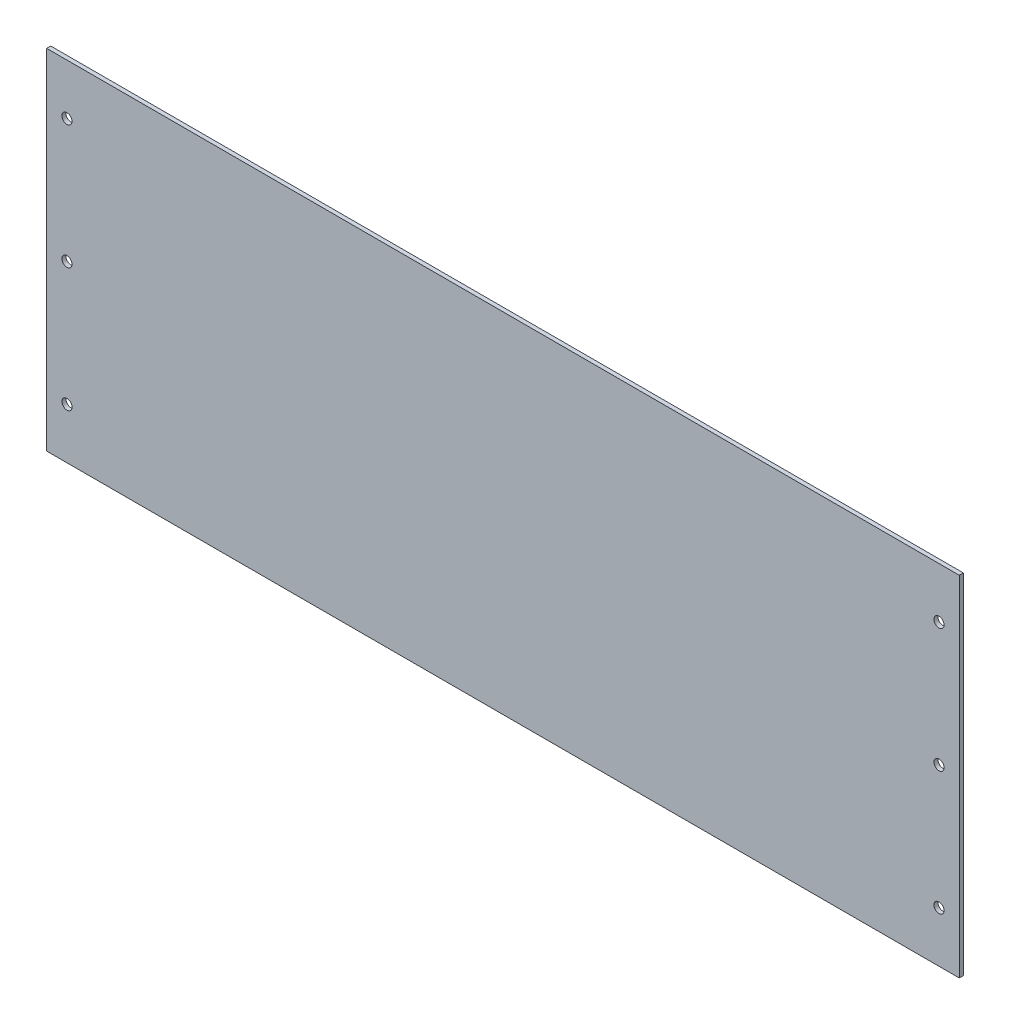
ISO-10303-21;
HEADER;
FILE_DESCRIPTION(('STEP AP214'),'2;1');
FILE_NAME('part.step','',(''),(''),'','','');
FILE_SCHEMA(('AUTOMOTIVE_DESIGN { 1 0 10303 214 1 1 1 1 }'));
ENDSEC;
DATA;
#1=APPLICATION_CONTEXT('core data for automotive mechanical design processes');
#2=APPLICATION_PROTOCOL_DEFINITION('international standard','automotive_design',2000,#1);
#3=PRODUCT_CONTEXT('',#1,'mechanical');
#4=PRODUCT('Part','Part','',(#3));
#5=PRODUCT_RELATED_PRODUCT_CATEGORY('part','',(#4));
#6=PRODUCT_DEFINITION_FORMATION('','',#4);
#7=PRODUCT_DEFINITION_CONTEXT('part definition',#1,'design');
#8=PRODUCT_DEFINITION('design','',#6,#7);
#9=PRODUCT_DEFINITION_SHAPE('','',#8);
#10=(LENGTH_UNIT() NAMED_UNIT(*) SI_UNIT(.MILLI.,.METRE.));
#11=(NAMED_UNIT(*) PLANE_ANGLE_UNIT() SI_UNIT($,.RADIAN.));
#12=(NAMED_UNIT(*) SI_UNIT($,.STERADIAN.) SOLID_ANGLE_UNIT());
#13=UNCERTAINTY_MEASURE_WITH_UNIT(LENGTH_MEASURE(1.E-05),#10,'distance_accuracy_value','');
#14=(GEOMETRIC_REPRESENTATION_CONTEXT(3) GLOBAL_UNCERTAINTY_ASSIGNED_CONTEXT((#13)) GLOBAL_UNIT_ASSIGNED_CONTEXT((#10,
#11,#12)) REPRESENTATION_CONTEXT('',''));
#15=CARTESIAN_POINT('',(0.,0.,0.));
#16=DIRECTION('',(0.,0.,1.));
#17=DIRECTION('',(1.,0.,0.));
#18=AXIS2_PLACEMENT_3D('',#15,#16,#17);
#19=CARTESIAN_POINT('',(225.,86.,2.));
#20=DIRECTION('',(-1.,0.,0.));
#21=DIRECTION('',(0.,0.,1.));
#22=AXIS2_PLACEMENT_3D('',#19,#20,#21);
#23=PLANE('',#22);
#24=DIRECTION('',(0.,1.,0.));
#25=VECTOR('',#24,1.);
#26=CARTESIAN_POINT('',(225.,86.,0.));
#27=LINE('',#26,#25);
#28=CARTESIAN_POINT('',(225.,-86.,0.));
#29=VERTEX_POINT('',#28);
#30=CARTESIAN_POINT('',(225.,86.,0.));
#31=VERTEX_POINT('',#30);
#32=EDGE_CURVE('E104',#29,#31,#27,.T.);
#33=ORIENTED_EDGE('',*,*,#32,.T.);
#34=DIRECTION('',(0.,0.,-1.));
#35=VECTOR('',#34,1.);
#36=CARTESIAN_POINT('',(225.,86.,2.));
#37=LINE('',#36,#35);
#38=CARTESIAN_POINT('',(225.,86.,2.));
#39=VERTEX_POINT('',#38);
#40=EDGE_CURVE('E11',#39,#31,#37,.T.);
#41=ORIENTED_EDGE('',*,*,#40,.F.);
#42=DIRECTION('',(0.,1.,0.));
#43=VECTOR('',#42,1.);
#44=CARTESIAN_POINT('',(225.,86.,2.));
#45=LINE('',#44,#43);
#46=CARTESIAN_POINT('',(225.,-86.,2.));
#47=VERTEX_POINT('',#46);
#48=EDGE_CURVE('E92',#47,#39,#45,.T.);
#49=ORIENTED_EDGE('',*,*,#48,.F.);
#50=DIRECTION('',(0.,0.,-1.));
#51=VECTOR('',#50,1.);
#52=CARTESIAN_POINT('',(225.,-86.,2.));
#53=LINE('',#52,#51);
#54=EDGE_CURVE('E100',#47,#29,#53,.T.);
#55=ORIENTED_EDGE('',*,*,#54,.T.);
#56=EDGE_LOOP('',(#33,#41,#49,#55));
#57=FACE_BOUND('',#56,.T.);
#58=ADVANCED_FACE('F41',(#57),#23,.F.);
#59=CARTESIAN_POINT('',(-225.,86.,2.));
#60=DIRECTION('',(0.,-1.,0.));
#61=DIRECTION('',(0.,0.,-1.));
#62=AXIS2_PLACEMENT_3D('',#59,#60,#61);
#63=PLANE('',#62);
#64=DIRECTION('',(-1.,0.,0.));
#65=VECTOR('',#64,1.);
#66=CARTESIAN_POINT('',(-225.,86.,0.));
#67=LINE('',#66,#65);
#68=CARTESIAN_POINT('',(-225.,86.,0.));
#69=VERTEX_POINT('',#68);
#70=EDGE_CURVE('E96',#31,#69,#67,.T.);
#71=ORIENTED_EDGE('',*,*,#70,.T.);
#72=DIRECTION('',(0.,0.,-1.));
#73=VECTOR('',#72,1.);
#74=CARTESIAN_POINT('',(-225.,86.,2.));
#75=LINE('',#74,#73);
#76=CARTESIAN_POINT('',(-225.,86.,2.));
#77=VERTEX_POINT('',#76);
#78=EDGE_CURVE('E49',#77,#69,#75,.T.);
#79=ORIENTED_EDGE('',*,*,#78,.F.);
#80=DIRECTION('',(-1.,0.,0.));
#81=VECTOR('',#80,1.);
#82=CARTESIAN_POINT('',(-225.,86.,2.));
#83=LINE('',#82,#81);
#84=EDGE_CURVE('E87',#39,#77,#83,.T.);
#85=ORIENTED_EDGE('',*,*,#84,.F.);
#86=ORIENTED_EDGE('',*,*,#40,.T.);
#87=EDGE_LOOP('',(#71,#79,#85,#86));
#88=FACE_BOUND('',#87,.T.);
#89=ADVANCED_FACE('F95',(#88),#63,.F.);
#90=CARTESIAN_POINT('',(-225.,86.,2.));
#91=DIRECTION('',(1.,0.,0.));
#92=DIRECTION('',(0.,0.,-1.));
#93=AXIS2_PLACEMENT_3D('',#90,#91,#92);
#94=PLANE('',#93);
#95=DIRECTION('',(0.,-1.,0.));
#96=VECTOR('',#95,1.);
#97=CARTESIAN_POINT('',(-225.,86.,0.));
#98=LINE('',#97,#96);
#99=CARTESIAN_POINT('',(-225.,-86.,0.));
#100=VERTEX_POINT('',#99);
#101=EDGE_CURVE('E74',#69,#100,#98,.T.);
#102=ORIENTED_EDGE('',*,*,#101,.T.);
#103=DIRECTION('',(0.,0.,-1.));
#104=VECTOR('',#103,1.);
#105=CARTESIAN_POINT('',(-225.,-86.,2.));
#106=LINE('',#105,#104);
#107=CARTESIAN_POINT('',(-225.,-86.,2.));
#108=VERTEX_POINT('',#107);
#109=EDGE_CURVE('E97',#108,#100,#106,.T.);
#110=ORIENTED_EDGE('',*,*,#109,.F.);
#111=DIRECTION('',(0.,-1.,0.));
#112=VECTOR('',#111,1.);
#113=CARTESIAN_POINT('',(-225.,86.,2.));
#114=LINE('',#113,#112);
#115=EDGE_CURVE('E90',#77,#108,#114,.T.);
#116=ORIENTED_EDGE('',*,*,#115,.F.);
#117=ORIENTED_EDGE('',*,*,#78,.T.);
#118=EDGE_LOOP('',(#102,#110,#116,#117));
#119=FACE_BOUND('',#118,.T.);
#120=ADVANCED_FACE('F98',(#119),#94,.F.);
#121=CARTESIAN_POINT('',(-225.,-86.,2.));
#122=DIRECTION('',(0.,1.,0.));
#123=DIRECTION('',(0.,0.,1.));
#124=AXIS2_PLACEMENT_3D('',#121,#122,#123);
#125=PLANE('',#124);
#126=DIRECTION('',(1.,0.,0.));
#127=VECTOR('',#126,1.);
#128=CARTESIAN_POINT('',(-225.,-86.,0.));
#129=LINE('',#128,#127);
#130=EDGE_CURVE('E80',#100,#29,#129,.T.);
#131=ORIENTED_EDGE('',*,*,#130,.T.);
#132=ORIENTED_EDGE('',*,*,#54,.F.);
#133=DIRECTION('',(1.,0.,0.));
#134=VECTOR('',#133,1.);
#135=CARTESIAN_POINT('',(-225.,-86.,2.));
#136=LINE('',#135,#134);
#137=EDGE_CURVE('E57',#108,#47,#136,.T.);
#138=ORIENTED_EDGE('',*,*,#137,.F.);
#139=ORIENTED_EDGE('',*,*,#109,.T.);
#140=EDGE_LOOP('',(#131,#132,#138,#139));
#141=FACE_BOUND('',#140,.T.);
#142=ADVANCED_FACE('F112',(#141),#125,.F.);
#143=CARTESIAN_POINT('',(0.,0.,2.));
#144=DIRECTION('',(0.,0.,1.));
#145=DIRECTION('',(1.,0.,0.));
#146=AXIS2_PLACEMENT_3D('',#143,#144,#145);
#147=PLANE('',#146);
#148=CARTESIAN_POINT('',(-215.,0.,2.));
#149=DIRECTION('',(0.,0.,1.));
#150=DIRECTION('',(1.,0.,0.));
#151=AXIS2_PLACEMENT_3D('',#148,#149,#150);
#152=CIRCLE('',#151,2.5);
#153=CARTESIAN_POINT('',(-212.5,0.,2.));
#154=VERTEX_POINT('',#153);
#155=EDGE_CURVE('E121',#154,#154,#152,.T.);
#156=ORIENTED_EDGE('',*,*,#155,.F.);
#157=EDGE_LOOP('',(#156));
#158=FACE_BOUND('',#157,.T.);
#159=CARTESIAN_POINT('',(215.,61.,2.));
#160=DIRECTION('',(0.,0.,1.));
#161=DIRECTION('',(1.,0.,0.));
#162=AXIS2_PLACEMENT_3D('',#159,#160,#161);
#163=CIRCLE('',#162,2.5);
#164=CARTESIAN_POINT('',(217.5,61.,2.));
#165=VERTEX_POINT('',#164);
#166=EDGE_CURVE('E140',#165,#165,#163,.T.);
#167=ORIENTED_EDGE('',*,*,#166,.F.);
#168=EDGE_LOOP('',(#167));
#169=FACE_BOUND('',#168,.T.);
#170=CARTESIAN_POINT('',(215.000000000001,-61.,2.));
#171=DIRECTION('',(0.,0.,1.));
#172=DIRECTION('',(1.,0.,0.));
#173=AXIS2_PLACEMENT_3D('',#170,#171,#172);
#174=CIRCLE('',#173,2.5);
#175=CARTESIAN_POINT('',(217.500000000001,-61.,2.));
#176=VERTEX_POINT('',#175);
#177=EDGE_CURVE('E134',#176,#176,#174,.T.);
#178=ORIENTED_EDGE('',*,*,#177,.F.);
#179=EDGE_LOOP('',(#178));
#180=FACE_BOUND('',#179,.T.);
#181=CARTESIAN_POINT('',(-214.999999999999,-61.,2.));
#182=DIRECTION('',(0.,0.,1.));
#183=DIRECTION('',(1.,0.,0.));
#184=AXIS2_PLACEMENT_3D('',#181,#182,#183);
#185=CIRCLE('',#184,2.5);
#186=CARTESIAN_POINT('',(-212.499999999999,-61.,2.));
#187=VERTEX_POINT('',#186);
#188=EDGE_CURVE('E127',#187,#187,#185,.T.);
#189=ORIENTED_EDGE('',*,*,#188,.F.);
#190=EDGE_LOOP('',(#189));
#191=FACE_BOUND('',#190,.T.);
#192=CARTESIAN_POINT('',(215.,0.,2.));
#193=DIRECTION('',(0.,0.,1.));
#194=DIRECTION('',(1.,0.,0.));
#195=AXIS2_PLACEMENT_3D('',#192,#193,#194);
#196=CIRCLE('',#195,2.5);
#197=CARTESIAN_POINT('',(217.5,0.,2.));
#198=VERTEX_POINT('',#197);
#199=EDGE_CURVE('E128',#198,#198,#196,.T.);
#200=ORIENTED_EDGE('',*,*,#199,.F.);
#201=EDGE_LOOP('',(#200));
#202=FACE_BOUND('',#201,.T.);
#203=CARTESIAN_POINT('',(-215.,61.,2.));
#204=DIRECTION('',(0.,0.,1.));
#205=DIRECTION('',(1.,0.,0.));
#206=AXIS2_PLACEMENT_3D('',#203,#204,#205);
#207=CIRCLE('',#206,2.5);
#208=CARTESIAN_POINT('',(-212.5,61.,2.));
#209=VERTEX_POINT('',#208);
#210=EDGE_CURVE('E118',#209,#209,#207,.T.);
#211=ORIENTED_EDGE('',*,*,#210,.F.);
#212=EDGE_LOOP('',(#211));
#213=FACE_BOUND('',#212,.T.);
#214=ORIENTED_EDGE('',*,*,#48,.T.);
#215=ORIENTED_EDGE('',*,*,#84,.T.);
#216=ORIENTED_EDGE('',*,*,#115,.T.);
#217=ORIENTED_EDGE('',*,*,#137,.T.);
#218=EDGE_LOOP('',(#214,#215,#216,#217));
#219=FACE_BOUND('',#218,.T.);
#220=ADVANCED_FACE('F88',(#158,#169,#180,#191,#202,#213,#219),#147,.T.);
#221=CARTESIAN_POINT('',(0.,0.,0.));
#222=DIRECTION('',(0.,0.,1.));
#223=DIRECTION('',(1.,0.,0.));
#224=AXIS2_PLACEMENT_3D('',#221,#222,#223);
#225=PLANE('',#224);
#226=CARTESIAN_POINT('',(-215.,0.,0.));
#227=DIRECTION('',(0.,0.,1.));
#228=DIRECTION('',(1.,0.,0.));
#229=AXIS2_PLACEMENT_3D('',#226,#227,#228);
#230=CIRCLE('',#229,2.5);
#231=CARTESIAN_POINT('',(-212.5,0.,0.));
#232=VERTEX_POINT('',#231);
#233=EDGE_CURVE('E143',#232,#232,#230,.T.);
#234=ORIENTED_EDGE('',*,*,#233,.T.);
#235=EDGE_LOOP('',(#234));
#236=FACE_BOUND('',#235,.T.);
#237=CARTESIAN_POINT('',(215.,61.,0.));
#238=DIRECTION('',(0.,0.,1.));
#239=DIRECTION('',(1.,0.,0.));
#240=AXIS2_PLACEMENT_3D('',#237,#238,#239);
#241=CIRCLE('',#240,2.5);
#242=CARTESIAN_POINT('',(217.5,61.,0.));
#243=VERTEX_POINT('',#242);
#244=EDGE_CURVE('E137',#243,#243,#241,.T.);
#245=ORIENTED_EDGE('',*,*,#244,.T.);
#246=EDGE_LOOP('',(#245));
#247=FACE_BOUND('',#246,.T.);
#248=CARTESIAN_POINT('',(215.000000000001,-61.,0.));
#249=DIRECTION('',(0.,0.,1.));
#250=DIRECTION('',(1.,0.,0.));
#251=AXIS2_PLACEMENT_3D('',#248,#249,#250);
#252=CIRCLE('',#251,2.5);
#253=CARTESIAN_POINT('',(217.500000000001,-61.,0.));
#254=VERTEX_POINT('',#253);
#255=EDGE_CURVE('E131',#254,#254,#252,.T.);
#256=ORIENTED_EDGE('',*,*,#255,.T.);
#257=EDGE_LOOP('',(#256));
#258=FACE_BOUND('',#257,.T.);
#259=CARTESIAN_POINT('',(-214.999999999999,-61.,0.));
#260=DIRECTION('',(0.,0.,1.));
#261=DIRECTION('',(1.,0.,0.));
#262=AXIS2_PLACEMENT_3D('',#259,#260,#261);
#263=CIRCLE('',#262,2.5);
#264=CARTESIAN_POINT('',(-212.499999999999,-61.,0.));
#265=VERTEX_POINT('',#264);
#266=EDGE_CURVE('E124',#265,#265,#263,.T.);
#267=ORIENTED_EDGE('',*,*,#266,.T.);
#268=EDGE_LOOP('',(#267));
#269=FACE_BOUND('',#268,.T.);
#270=CARTESIAN_POINT('',(215.,0.,0.));
#271=DIRECTION('',(0.,0.,1.));
#272=DIRECTION('',(1.,0.,0.));
#273=AXIS2_PLACEMENT_3D('',#270,#271,#272);
#274=CIRCLE('',#273,2.5);
#275=CARTESIAN_POINT('',(217.5,0.,0.));
#276=VERTEX_POINT('',#275);
#277=EDGE_CURVE('E148',#276,#276,#274,.T.);
#278=ORIENTED_EDGE('',*,*,#277,.T.);
#279=EDGE_LOOP('',(#278));
#280=FACE_BOUND('',#279,.T.);
#281=CARTESIAN_POINT('',(-215.,61.,0.));
#282=DIRECTION('',(0.,0.,1.));
#283=DIRECTION('',(1.,0.,0.));
#284=AXIS2_PLACEMENT_3D('',#281,#282,#283);
#285=CIRCLE('',#284,2.5);
#286=CARTESIAN_POINT('',(-212.5,61.,0.));
#287=VERTEX_POINT('',#286);
#288=EDGE_CURVE('E107',#287,#287,#285,.T.);
#289=ORIENTED_EDGE('',*,*,#288,.T.);
#290=EDGE_LOOP('',(#289));
#291=FACE_BOUND('',#290,.T.);
#292=ORIENTED_EDGE('',*,*,#32,.F.);
#293=ORIENTED_EDGE('',*,*,#130,.F.);
#294=ORIENTED_EDGE('',*,*,#101,.F.);
#295=ORIENTED_EDGE('',*,*,#70,.F.);
#296=EDGE_LOOP('',(#292,#293,#294,#295));
#297=FACE_BOUND('',#296,.T.);
#298=ADVANCED_FACE('F115',(#236,#247,#258,#269,#280,#291,#297),#225,.F.);
#299=CARTESIAN_POINT('',(-215.,61.,0.));
#300=DIRECTION('',(0.,0.,1.));
#301=DIRECTION('',(1.,0.,0.));
#302=AXIS2_PLACEMENT_3D('',#299,#300,#301);
#303=CYLINDRICAL_SURFACE('',#302,2.5);
#304=ORIENTED_EDGE('',*,*,#288,.F.);
#305=EDGE_LOOP('',(#304));
#306=FACE_BOUND('',#305,.T.);
#307=ORIENTED_EDGE('',*,*,#210,.T.);
#308=EDGE_LOOP('',(#307));
#309=FACE_BOUND('',#308,.T.);
#310=ADVANCED_FACE('F162',(#306,#309),#303,.F.);
#311=CARTESIAN_POINT('',(215.,0.,0.));
#312=DIRECTION('',(0.,0.,1.));
#313=DIRECTION('',(1.,0.,0.));
#314=AXIS2_PLACEMENT_3D('',#311,#312,#313);
#315=CYLINDRICAL_SURFACE('',#314,2.5);
#316=ORIENTED_EDGE('',*,*,#277,.F.);
#317=EDGE_LOOP('',(#316));
#318=FACE_BOUND('',#317,.T.);
#319=ORIENTED_EDGE('',*,*,#199,.T.);
#320=EDGE_LOOP('',(#319));
#321=FACE_BOUND('',#320,.T.);
#322=ADVANCED_FACE('F154',(#318,#321),#315,.F.);
#323=CARTESIAN_POINT('',(-214.999999999999,-61.,0.));
#324=DIRECTION('',(0.,0.,1.));
#325=DIRECTION('',(1.,0.,0.));
#326=AXIS2_PLACEMENT_3D('',#323,#324,#325);
#327=CYLINDRICAL_SURFACE('',#326,2.5);
#328=ORIENTED_EDGE('',*,*,#266,.F.);
#329=EDGE_LOOP('',(#328));
#330=FACE_BOUND('',#329,.T.);
#331=ORIENTED_EDGE('',*,*,#188,.T.);
#332=EDGE_LOOP('',(#331));
#333=FACE_BOUND('',#332,.T.);
#334=ADVANCED_FACE('F170',(#330,#333),#327,.F.);
#335=CARTESIAN_POINT('',(215.000000000001,-61.,0.));
#336=DIRECTION('',(0.,0.,1.));
#337=DIRECTION('',(1.,0.,0.));
#338=AXIS2_PLACEMENT_3D('',#335,#336,#337);
#339=CYLINDRICAL_SURFACE('',#338,2.5);
#340=ORIENTED_EDGE('',*,*,#255,.F.);
#341=EDGE_LOOP('',(#340));
#342=FACE_BOUND('',#341,.T.);
#343=ORIENTED_EDGE('',*,*,#177,.T.);
#344=EDGE_LOOP('',(#343));
#345=FACE_BOUND('',#344,.T.);
#346=ADVANCED_FACE('F221',(#342,#345),#339,.F.);
#347=CARTESIAN_POINT('',(215.,61.,0.));
#348=DIRECTION('',(0.,0.,1.));
#349=DIRECTION('',(1.,0.,0.));
#350=AXIS2_PLACEMENT_3D('',#347,#348,#349);
#351=CYLINDRICAL_SURFACE('',#350,2.5);
#352=ORIENTED_EDGE('',*,*,#244,.F.);
#353=EDGE_LOOP('',(#352));
#354=FACE_BOUND('',#353,.T.);
#355=ORIENTED_EDGE('',*,*,#166,.T.);
#356=EDGE_LOOP('',(#355));
#357=FACE_BOUND('',#356,.T.);
#358=ADVANCED_FACE('F231',(#354,#357),#351,.F.);
#359=CARTESIAN_POINT('',(-215.,0.,0.));
#360=DIRECTION('',(0.,0.,1.));
#361=DIRECTION('',(1.,0.,0.));
#362=AXIS2_PLACEMENT_3D('',#359,#360,#361);
#363=CYLINDRICAL_SURFACE('',#362,2.5);
#364=ORIENTED_EDGE('',*,*,#233,.F.);
#365=EDGE_LOOP('',(#364));
#366=FACE_BOUND('',#365,.T.);
#367=ORIENTED_EDGE('',*,*,#155,.T.);
#368=EDGE_LOOP('',(#367));
#369=FACE_BOUND('',#368,.T.);
#370=ADVANCED_FACE('F242',(#366,#369),#363,.F.);
#371=CLOSED_SHELL('',(#58,#89,#120,#142,#220,#298,#310,#322,#334,#346,#358,#370));
#372=MANIFOLD_SOLID_BREP('B2',#371);
#373=ADVANCED_BREP_SHAPE_REPRESENTATION('',(#18,#372),#14);
#374=SHAPE_DEFINITION_REPRESENTATION(#9,#373);
ENDSEC;
END-ISO-10303-21;
